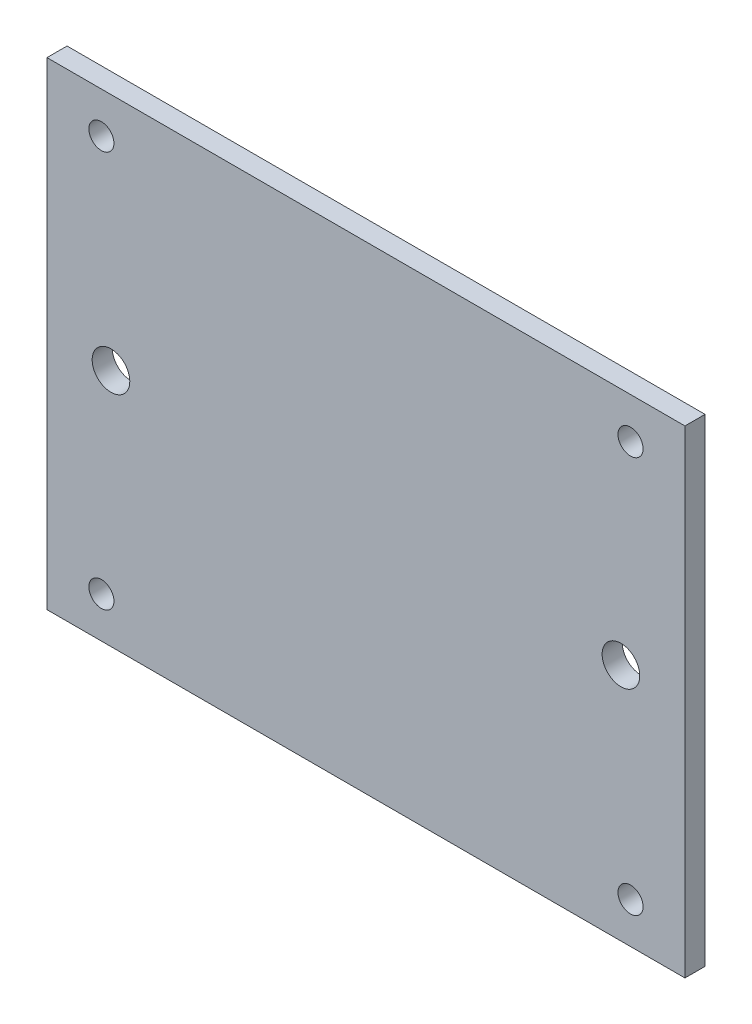
ISO-10303-21;
HEADER;
FILE_DESCRIPTION(('STEP AP214'),'2;1');
FILE_NAME('part.step','',(''),(''),'','','');
FILE_SCHEMA(('AUTOMOTIVE_DESIGN { 1 0 10303 214 1 1 1 1 }'));
ENDSEC;
DATA;
#1=APPLICATION_CONTEXT('core data for automotive mechanical design processes');
#2=APPLICATION_PROTOCOL_DEFINITION('international standard','automotive_design',2000,#1);
#3=PRODUCT_CONTEXT('',#1,'mechanical');
#4=PRODUCT('Part','Part','',(#3));
#5=PRODUCT_RELATED_PRODUCT_CATEGORY('part','',(#4));
#6=PRODUCT_DEFINITION_FORMATION('','',#4);
#7=PRODUCT_DEFINITION_CONTEXT('part definition',#1,'design');
#8=PRODUCT_DEFINITION('design','',#6,#7);
#9=PRODUCT_DEFINITION_SHAPE('','',#8);
#10=(LENGTH_UNIT() NAMED_UNIT(*) SI_UNIT(.MILLI.,.METRE.));
#11=(NAMED_UNIT(*) PLANE_ANGLE_UNIT() SI_UNIT($,.RADIAN.));
#12=(NAMED_UNIT(*) SI_UNIT($,.STERADIAN.) SOLID_ANGLE_UNIT());
#13=UNCERTAINTY_MEASURE_WITH_UNIT(LENGTH_MEASURE(1.E-05),#10,'distance_accuracy_value','');
#14=(GEOMETRIC_REPRESENTATION_CONTEXT(3) GLOBAL_UNCERTAINTY_ASSIGNED_CONTEXT((#13)) GLOBAL_UNIT_ASSIGNED_CONTEXT((#10,
#11,#12)) REPRESENTATION_CONTEXT('',''));
#15=CARTESIAN_POINT('',(0.,0.,0.));
#16=DIRECTION('',(0.,0.,1.));
#17=DIRECTION('',(1.,0.,0.));
#18=AXIS2_PLACEMENT_3D('',#15,#16,#17);
#19=CARTESIAN_POINT('',(0.,0.,1.6));
#20=DIRECTION('',(0.,0.,-1.));
#21=DIRECTION('',(-1.,0.,0.));
#22=AXIS2_PLACEMENT_3D('',#19,#20,#21);
#23=PLANE('',#22);
#24=DIRECTION('',(0.,1.,0.));
#25=VECTOR('',#24,1.);
#26=CARTESIAN_POINT('',(25.42,-19.05,1.6));
#27=LINE('',#26,#25);
#28=CARTESIAN_POINT('',(25.42,-19.05,1.6));
#29=VERTEX_POINT('',#28);
#30=CARTESIAN_POINT('',(25.42,19.05,1.6));
#31=VERTEX_POINT('',#30);
#32=EDGE_CURVE('E93',#29,#31,#27,.T.);
#33=ORIENTED_EDGE('',*,*,#32,.T.);
#34=DIRECTION('',(-1.,0.,0.));
#35=VECTOR('',#34,1.);
#36=CARTESIAN_POINT('',(-25.42,19.05,1.6));
#37=LINE('',#36,#35);
#38=CARTESIAN_POINT('',(-25.42,19.05,1.6));
#39=VERTEX_POINT('',#38);
#40=EDGE_CURVE('E88',#31,#39,#37,.T.);
#41=ORIENTED_EDGE('',*,*,#40,.T.);
#42=DIRECTION('',(0.,-1.,0.));
#43=VECTOR('',#42,1.);
#44=CARTESIAN_POINT('',(-25.42,-19.05,1.6));
#45=LINE('',#44,#43);
#46=CARTESIAN_POINT('',(-25.42,-19.05,1.6));
#47=VERTEX_POINT('',#46);
#48=EDGE_CURVE('E91',#39,#47,#45,.T.);
#49=ORIENTED_EDGE('',*,*,#48,.T.);
#50=DIRECTION('',(1.,0.,0.));
#51=VECTOR('',#50,1.);
#52=CARTESIAN_POINT('',(-25.42,-19.05,1.6));
#53=LINE('',#52,#51);
#54=EDGE_CURVE('E58',#47,#29,#53,.T.);
#55=ORIENTED_EDGE('',*,*,#54,.T.);
#56=EDGE_LOOP('',(#33,#41,#49,#55));
#57=FACE_BOUND('',#56,.T.);
#58=CARTESIAN_POINT('',(20.32,0.,1.6));
#59=DIRECTION('',(0.,0.,1.));
#60=DIRECTION('',(-1.,0.,0.));
#61=AXIS2_PLACEMENT_3D('',#58,#59,#60);
#62=CIRCLE('',#61,1.5);
#63=CARTESIAN_POINT('',(18.82,0.,1.6));
#64=VERTEX_POINT('',#63);
#65=EDGE_CURVE('E108',#64,#64,#62,.T.);
#66=ORIENTED_EDGE('',*,*,#65,.F.);
#67=EDGE_LOOP('',(#66));
#68=FACE_BOUND('',#67,.T.);
#69=CARTESIAN_POINT('',(-21.0832545931759,15.8,1.6));
#70=DIRECTION('',(0.,0.,1.));
#71=DIRECTION('',(1.,0.,0.));
#72=AXIS2_PLACEMENT_3D('',#69,#70,#71);
#73=CIRCLE('',#72,1.);
#74=CARTESIAN_POINT('',(-20.0832545931759,15.8,1.6));
#75=VERTEX_POINT('',#74);
#76=EDGE_CURVE('E123',#75,#75,#73,.T.);
#77=ORIENTED_EDGE('',*,*,#76,.F.);
#78=EDGE_LOOP('',(#77));
#79=FACE_BOUND('',#78,.T.);
#80=CARTESIAN_POINT('',(21.0832545931759,15.8,1.6));
#81=DIRECTION('',(0.,0.,1.));
#82=DIRECTION('',(-1.,0.,0.));
#83=AXIS2_PLACEMENT_3D('',#80,#81,#82);
#84=CIRCLE('',#83,1.);
#85=CARTESIAN_POINT('',(20.0832545931759,15.8,1.6));
#86=VERTEX_POINT('',#85);
#87=EDGE_CURVE('E129',#86,#86,#84,.T.);
#88=ORIENTED_EDGE('',*,*,#87,.F.);
#89=EDGE_LOOP('',(#88));
#90=FACE_BOUND('',#89,.T.);
#91=CARTESIAN_POINT('',(21.0832545931759,-15.8,1.6));
#92=DIRECTION('',(0.,0.,1.));
#93=DIRECTION('',(1.,0.,0.));
#94=AXIS2_PLACEMENT_3D('',#91,#92,#93);
#95=CIRCLE('',#94,1.);
#96=CARTESIAN_POINT('',(22.0832545931759,-15.8,1.6));
#97=VERTEX_POINT('',#96);
#98=EDGE_CURVE('E135',#97,#97,#95,.T.);
#99=ORIENTED_EDGE('',*,*,#98,.F.);
#100=EDGE_LOOP('',(#99));
#101=FACE_BOUND('',#100,.T.);
#102=CARTESIAN_POINT('',(-21.0832545931759,-15.8,1.6));
#103=DIRECTION('',(0.,0.,1.));
#104=DIRECTION('',(-1.,0.,0.));
#105=AXIS2_PLACEMENT_3D('',#102,#103,#104);
#106=CIRCLE('',#105,1.);
#107=CARTESIAN_POINT('',(-22.0832545931759,-15.8,1.6));
#108=VERTEX_POINT('',#107);
#109=EDGE_CURVE('E141',#108,#108,#106,.T.);
#110=ORIENTED_EDGE('',*,*,#109,.F.);
#111=EDGE_LOOP('',(#110));
#112=FACE_BOUND('',#111,.T.);
#113=CARTESIAN_POINT('',(-20.32,0.,1.6));
#114=DIRECTION('',(0.,0.,1.));
#115=DIRECTION('',(1.,0.,0.));
#116=AXIS2_PLACEMENT_3D('',#113,#114,#115);
#117=CIRCLE('',#116,1.5);
#118=CARTESIAN_POINT('',(-18.82,0.,1.6));
#119=VERTEX_POINT('',#118);
#120=EDGE_CURVE('E147',#119,#119,#117,.T.);
#121=ORIENTED_EDGE('',*,*,#120,.F.);
#122=EDGE_LOOP('',(#121));
#123=FACE_BOUND('',#122,.T.);
#124=ADVANCED_FACE('F41',(#57,#68,#79,#90,#101,#112,#123),#23,.F.);
#125=CARTESIAN_POINT('',(0.,0.,0.));
#126=DIRECTION('',(0.,0.,-1.));
#127=DIRECTION('',(-1.,0.,0.));
#128=AXIS2_PLACEMENT_3D('',#125,#126,#127);
#129=PLANE('',#128);
#130=CARTESIAN_POINT('',(-21.0832545931759,-15.8,0.));
#131=DIRECTION('',(0.,0.,1.));
#132=DIRECTION('',(-1.,0.,0.));
#133=AXIS2_PLACEMENT_3D('',#130,#131,#132);
#134=CIRCLE('',#133,1.);
#135=CARTESIAN_POINT('',(-22.0832545931759,-15.8,0.));
#136=VERTEX_POINT('',#135);
#137=EDGE_CURVE('E144',#136,#136,#134,.T.);
#138=ORIENTED_EDGE('',*,*,#137,.T.);
#139=EDGE_LOOP('',(#138));
#140=FACE_BOUND('',#139,.T.);
#141=CARTESIAN_POINT('',(21.0832545931759,15.8,0.));
#142=DIRECTION('',(0.,0.,1.));
#143=DIRECTION('',(-1.,0.,0.));
#144=AXIS2_PLACEMENT_3D('',#141,#142,#143);
#145=CIRCLE('',#144,1.);
#146=CARTESIAN_POINT('',(20.0832545931759,15.8,0.));
#147=VERTEX_POINT('',#146);
#148=EDGE_CURVE('E132',#147,#147,#145,.T.);
#149=ORIENTED_EDGE('',*,*,#148,.T.);
#150=EDGE_LOOP('',(#149));
#151=FACE_BOUND('',#150,.T.);
#152=CARTESIAN_POINT('',(20.32,0.,0.));
#153=DIRECTION('',(0.,0.,1.));
#154=DIRECTION('',(-1.,0.,0.));
#155=AXIS2_PLACEMENT_3D('',#152,#153,#154);
#156=CIRCLE('',#155,1.5);
#157=CARTESIAN_POINT('',(18.82,0.,0.));
#158=VERTEX_POINT('',#157);
#159=EDGE_CURVE('E120',#158,#158,#156,.T.);
#160=ORIENTED_EDGE('',*,*,#159,.T.);
#161=EDGE_LOOP('',(#160));
#162=FACE_BOUND('',#161,.T.);
#163=DIRECTION('',(0.,1.,0.));
#164=VECTOR('',#163,1.);
#165=CARTESIAN_POINT('',(25.42,-19.05,0.));
#166=LINE('',#165,#164);
#167=CARTESIAN_POINT('',(25.42,-19.05,0.));
#168=VERTEX_POINT('',#167);
#169=CARTESIAN_POINT('',(25.42,19.05,0.));
#170=VERTEX_POINT('',#169);
#171=EDGE_CURVE('E105',#168,#170,#166,.T.);
#172=ORIENTED_EDGE('',*,*,#171,.F.);
#173=DIRECTION('',(1.,0.,0.));
#174=VECTOR('',#173,1.);
#175=CARTESIAN_POINT('',(-25.42,-19.05,0.));
#176=LINE('',#175,#174);
#177=CARTESIAN_POINT('',(-25.42,-19.05,0.));
#178=VERTEX_POINT('',#177);
#179=EDGE_CURVE('E81',#178,#168,#176,.T.);
#180=ORIENTED_EDGE('',*,*,#179,.F.);
#181=DIRECTION('',(0.,-1.,0.));
#182=VECTOR('',#181,1.);
#183=CARTESIAN_POINT('',(-25.42,-19.05,0.));
#184=LINE('',#183,#182);
#185=CARTESIAN_POINT('',(-25.42,19.05,0.));
#186=VERTEX_POINT('',#185);
#187=EDGE_CURVE('E75',#186,#178,#184,.T.);
#188=ORIENTED_EDGE('',*,*,#187,.F.);
#189=DIRECTION('',(-1.,0.,0.));
#190=VECTOR('',#189,1.);
#191=CARTESIAN_POINT('',(-25.42,19.05,0.));
#192=LINE('',#191,#190);
#193=EDGE_CURVE('E97',#170,#186,#192,.T.);
#194=ORIENTED_EDGE('',*,*,#193,.F.);
#195=EDGE_LOOP('',(#172,#180,#188,#194));
#196=FACE_BOUND('',#195,.T.);
#197=CARTESIAN_POINT('',(-21.0832545931759,15.8,0.));
#198=DIRECTION('',(0.,0.,1.));
#199=DIRECTION('',(1.,0.,0.));
#200=AXIS2_PLACEMENT_3D('',#197,#198,#199);
#201=CIRCLE('',#200,1.);
#202=CARTESIAN_POINT('',(-20.0832545931759,15.8,0.));
#203=VERTEX_POINT('',#202);
#204=EDGE_CURVE('E126',#203,#203,#201,.T.);
#205=ORIENTED_EDGE('',*,*,#204,.T.);
#206=EDGE_LOOP('',(#205));
#207=FACE_BOUND('',#206,.T.);
#208=CARTESIAN_POINT('',(21.0832545931759,-15.8,0.));
#209=DIRECTION('',(0.,0.,1.));
#210=DIRECTION('',(1.,0.,0.));
#211=AXIS2_PLACEMENT_3D('',#208,#209,#210);
#212=CIRCLE('',#211,1.);
#213=CARTESIAN_POINT('',(22.0832545931759,-15.8,0.));
#214=VERTEX_POINT('',#213);
#215=EDGE_CURVE('E138',#214,#214,#212,.T.);
#216=ORIENTED_EDGE('',*,*,#215,.T.);
#217=EDGE_LOOP('',(#216));
#218=FACE_BOUND('',#217,.T.);
#219=CARTESIAN_POINT('',(-20.32,0.,0.));
#220=DIRECTION('',(0.,0.,1.));
#221=DIRECTION('',(1.,0.,0.));
#222=AXIS2_PLACEMENT_3D('',#219,#220,#221);
#223=CIRCLE('',#222,1.5);
#224=CARTESIAN_POINT('',(-18.82,0.,0.));
#225=VERTEX_POINT('',#224);
#226=EDGE_CURVE('E150',#225,#225,#223,.T.);
#227=ORIENTED_EDGE('',*,*,#226,.T.);
#228=EDGE_LOOP('',(#227));
#229=FACE_BOUND('',#228,.T.);
#230=ADVANCED_FACE('F116',(#140,#151,#162,#196,#207,#218,#229),#129,.T.);
#231=CARTESIAN_POINT('',(25.42,-19.05,1.6));
#232=DIRECTION('',(-1.,0.,0.));
#233=DIRECTION('',(0.,0.,1.));
#234=AXIS2_PLACEMENT_3D('',#231,#232,#233);
#235=PLANE('',#234);
#236=ORIENTED_EDGE('',*,*,#171,.T.);
#237=DIRECTION('',(0.,0.,-1.));
#238=VECTOR('',#237,1.);
#239=CARTESIAN_POINT('',(25.42,19.05,1.6));
#240=LINE('',#239,#238);
#241=EDGE_CURVE('E11',#31,#170,#240,.T.);
#242=ORIENTED_EDGE('',*,*,#241,.F.);
#243=ORIENTED_EDGE('',*,*,#32,.F.);
#244=DIRECTION('',(0.,0.,-1.));
#245=VECTOR('',#244,1.);
#246=CARTESIAN_POINT('',(25.42,-19.05,1.6));
#247=LINE('',#246,#245);
#248=EDGE_CURVE('E101',#29,#168,#247,.T.);
#249=ORIENTED_EDGE('',*,*,#248,.T.);
#250=EDGE_LOOP('',(#236,#242,#243,#249));
#251=FACE_BOUND('',#250,.T.);
#252=ADVANCED_FACE('F43',(#251),#235,.F.);
#253=CARTESIAN_POINT('',(-25.42,19.05,1.6));
#254=DIRECTION('',(0.,-1.,0.));
#255=DIRECTION('',(1.,0.,0.));
#256=AXIS2_PLACEMENT_3D('',#253,#254,#255);
#257=PLANE('',#256);
#258=ORIENTED_EDGE('',*,*,#193,.T.);
#259=DIRECTION('',(0.,0.,-1.));
#260=VECTOR('',#259,1.);
#261=CARTESIAN_POINT('',(-25.42,19.05,1.6));
#262=LINE('',#261,#260);
#263=EDGE_CURVE('E50',#39,#186,#262,.T.);
#264=ORIENTED_EDGE('',*,*,#263,.F.);
#265=ORIENTED_EDGE('',*,*,#40,.F.);
#266=ORIENTED_EDGE('',*,*,#241,.T.);
#267=EDGE_LOOP('',(#258,#264,#265,#266));
#268=FACE_BOUND('',#267,.T.);
#269=ADVANCED_FACE('F96',(#268),#257,.F.);
#270=CARTESIAN_POINT('',(-25.42,-19.05,1.6));
#271=DIRECTION('',(1.,0.,0.));
#272=DIRECTION('',(0.,1.,0.));
#273=AXIS2_PLACEMENT_3D('',#270,#271,#272);
#274=PLANE('',#273);
#275=ORIENTED_EDGE('',*,*,#187,.T.);
#276=DIRECTION('',(0.,0.,-1.));
#277=VECTOR('',#276,1.);
#278=CARTESIAN_POINT('',(-25.42,-19.05,1.6));
#279=LINE('',#278,#277);
#280=EDGE_CURVE('E98',#47,#178,#279,.T.);
#281=ORIENTED_EDGE('',*,*,#280,.F.);
#282=ORIENTED_EDGE('',*,*,#48,.F.);
#283=ORIENTED_EDGE('',*,*,#263,.T.);
#284=EDGE_LOOP('',(#275,#281,#282,#283));
#285=FACE_BOUND('',#284,.T.);
#286=ADVANCED_FACE('F99',(#285),#274,.F.);
#287=CARTESIAN_POINT('',(-25.42,-19.05,1.6));
#288=DIRECTION('',(0.,1.,0.));
#289=DIRECTION('',(0.,0.,1.));
#290=AXIS2_PLACEMENT_3D('',#287,#288,#289);
#291=PLANE('',#290);
#292=ORIENTED_EDGE('',*,*,#179,.T.);
#293=ORIENTED_EDGE('',*,*,#248,.F.);
#294=ORIENTED_EDGE('',*,*,#54,.F.);
#295=ORIENTED_EDGE('',*,*,#280,.T.);
#296=EDGE_LOOP('',(#292,#293,#294,#295));
#297=FACE_BOUND('',#296,.T.);
#298=ADVANCED_FACE('F113',(#297),#291,.F.);
#299=CARTESIAN_POINT('',(20.32,0.,1.6));
#300=DIRECTION('',(0.,0.,-1.));
#301=DIRECTION('',(-1.,0.,0.));
#302=AXIS2_PLACEMENT_3D('',#299,#300,#301);
#303=CYLINDRICAL_SURFACE('',#302,1.5);
#304=ORIENTED_EDGE('',*,*,#65,.T.);
#305=EDGE_LOOP('',(#304));
#306=FACE_BOUND('',#305,.T.);
#307=ORIENTED_EDGE('',*,*,#159,.F.);
#308=EDGE_LOOP('',(#307));
#309=FACE_BOUND('',#308,.T.);
#310=ADVANCED_FACE('F167',(#306,#309),#303,.F.);
#311=CARTESIAN_POINT('',(-21.0832545931759,15.8,1.6));
#312=DIRECTION('',(0.,0.,-1.));
#313=DIRECTION('',(-1.,0.,0.));
#314=AXIS2_PLACEMENT_3D('',#311,#312,#313);
#315=CYLINDRICAL_SURFACE('',#314,1.);
#316=ORIENTED_EDGE('',*,*,#76,.T.);
#317=EDGE_LOOP('',(#316));
#318=FACE_BOUND('',#317,.T.);
#319=ORIENTED_EDGE('',*,*,#204,.F.);
#320=EDGE_LOOP('',(#319));
#321=FACE_BOUND('',#320,.T.);
#322=ADVANCED_FACE('F212',(#318,#321),#315,.F.);
#323=CARTESIAN_POINT('',(21.0832545931759,15.8,1.6));
#324=DIRECTION('',(0.,0.,-1.));
#325=DIRECTION('',(-1.,0.,0.));
#326=AXIS2_PLACEMENT_3D('',#323,#324,#325);
#327=CYLINDRICAL_SURFACE('',#326,1.);
#328=ORIENTED_EDGE('',*,*,#87,.T.);
#329=EDGE_LOOP('',(#328));
#330=FACE_BOUND('',#329,.T.);
#331=ORIENTED_EDGE('',*,*,#148,.F.);
#332=EDGE_LOOP('',(#331));
#333=FACE_BOUND('',#332,.T.);
#334=ADVANCED_FACE('F220',(#330,#333),#327,.F.);
#335=CARTESIAN_POINT('',(21.0832545931759,-15.8,1.6));
#336=DIRECTION('',(0.,0.,-1.));
#337=DIRECTION('',(-1.,0.,0.));
#338=AXIS2_PLACEMENT_3D('',#335,#336,#337);
#339=CYLINDRICAL_SURFACE('',#338,1.);
#340=ORIENTED_EDGE('',*,*,#98,.T.);
#341=EDGE_LOOP('',(#340));
#342=FACE_BOUND('',#341,.T.);
#343=ORIENTED_EDGE('',*,*,#215,.F.);
#344=EDGE_LOOP('',(#343));
#345=FACE_BOUND('',#344,.T.);
#346=ADVANCED_FACE('F228',(#342,#345),#339,.F.);
#347=CARTESIAN_POINT('',(-21.0832545931759,-15.8,1.6));
#348=DIRECTION('',(0.,0.,-1.));
#349=DIRECTION('',(-1.,0.,0.));
#350=AXIS2_PLACEMENT_3D('',#347,#348,#349);
#351=CYLINDRICAL_SURFACE('',#350,1.);
#352=ORIENTED_EDGE('',*,*,#109,.T.);
#353=EDGE_LOOP('',(#352));
#354=FACE_BOUND('',#353,.T.);
#355=ORIENTED_EDGE('',*,*,#137,.F.);
#356=EDGE_LOOP('',(#355));
#357=FACE_BOUND('',#356,.T.);
#358=ADVANCED_FACE('F237',(#354,#357),#351,.F.);
#359=CARTESIAN_POINT('',(-20.32,0.,1.6));
#360=DIRECTION('',(0.,0.,-1.));
#361=DIRECTION('',(-1.,0.,0.));
#362=AXIS2_PLACEMENT_3D('',#359,#360,#361);
#363=CYLINDRICAL_SURFACE('',#362,1.5);
#364=ORIENTED_EDGE('',*,*,#120,.T.);
#365=EDGE_LOOP('',(#364));
#366=FACE_BOUND('',#365,.T.);
#367=ORIENTED_EDGE('',*,*,#226,.F.);
#368=EDGE_LOOP('',(#367));
#369=FACE_BOUND('',#368,.T.);
#370=ADVANCED_FACE('F156',(#366,#369),#363,.F.);
#371=CLOSED_SHELL('',(#124,#230,#252,#269,#286,#298,#310,#322,#334,#346,#358,#370));
#372=MANIFOLD_SOLID_BREP('B2',#371);
#373=ADVANCED_BREP_SHAPE_REPRESENTATION('',(#18,#372),#14);
#374=SHAPE_DEFINITION_REPRESENTATION(#9,#373);
ENDSEC;
END-ISO-10303-21;
